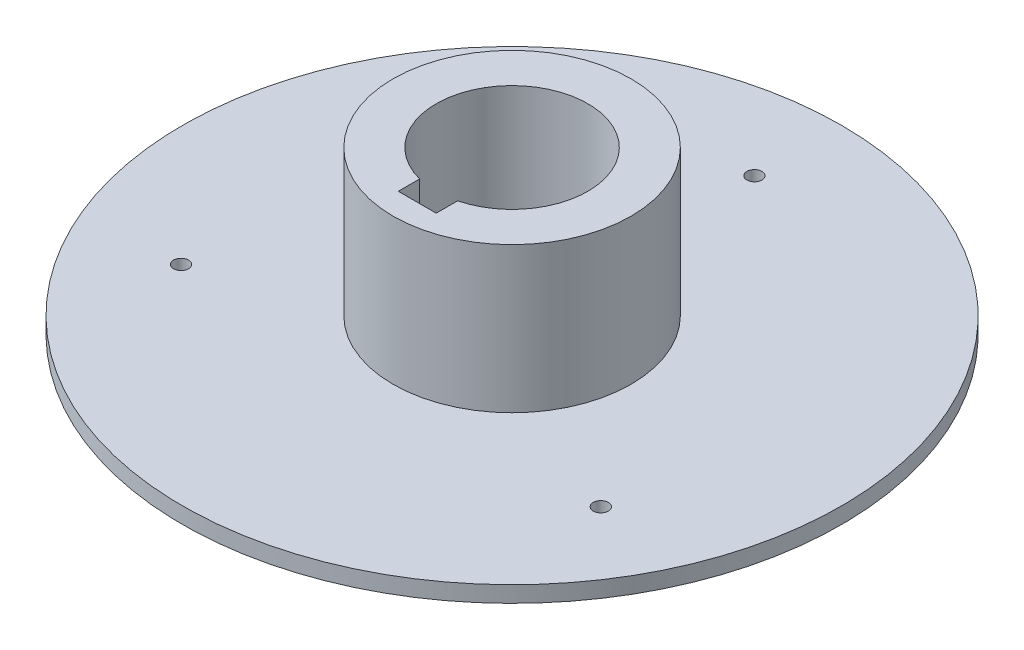
ISO-10303-21;
HEADER;
FILE_DESCRIPTION(('STEP AP214'),'2;1');
FILE_NAME('part.step','',(''),(''),'','','');
FILE_SCHEMA(('AUTOMOTIVE_DESIGN { 1 0 10303 214 1 1 1 1 }'));
ENDSEC;
DATA;
#1=APPLICATION_CONTEXT('core data for automotive mechanical design processes');
#2=APPLICATION_PROTOCOL_DEFINITION('international standard','automotive_design',2000,#1);
#3=PRODUCT_CONTEXT('',#1,'mechanical');
#4=PRODUCT('Part','Part','',(#3));
#5=PRODUCT_RELATED_PRODUCT_CATEGORY('part','',(#4));
#6=PRODUCT_DEFINITION_FORMATION('','',#4);
#7=PRODUCT_DEFINITION_CONTEXT('part definition',#1,'design');
#8=PRODUCT_DEFINITION('design','',#6,#7);
#9=PRODUCT_DEFINITION_SHAPE('','',#8);
#10=(LENGTH_UNIT() NAMED_UNIT(*) SI_UNIT(.MILLI.,.METRE.));
#11=(NAMED_UNIT(*) PLANE_ANGLE_UNIT() SI_UNIT($,.RADIAN.));
#12=(NAMED_UNIT(*) SI_UNIT($,.STERADIAN.) SOLID_ANGLE_UNIT());
#13=UNCERTAINTY_MEASURE_WITH_UNIT(LENGTH_MEASURE(1.E-05),#10,'distance_accuracy_value','');
#14=(GEOMETRIC_REPRESENTATION_CONTEXT(3) GLOBAL_UNCERTAINTY_ASSIGNED_CONTEXT((#13)) GLOBAL_UNIT_ASSIGNED_CONTEXT((#10,
#11,#12)) REPRESENTATION_CONTEXT('',''));
#15=CARTESIAN_POINT('',(0.,0.,0.));
#16=DIRECTION('',(0.,0.,1.));
#17=DIRECTION('',(1.,0.,0.));
#18=AXIS2_PLACEMENT_3D('',#15,#16,#17);
#19=CARTESIAN_POINT('',(0.,0.,0.));
#20=DIRECTION('',(0.,-1.,0.));
#21=DIRECTION('',(0.,0.,-1.));
#22=AXIS2_PLACEMENT_3D('',#19,#20,#21);
#23=CYLINDRICAL_SURFACE('',#22,69.5121297332499);
#24=CARTESIAN_POINT('',(0.,3.41233608835754,0.));
#25=DIRECTION('',(0.,-1.,0.));
#26=DIRECTION('',(0.,0.,-1.));
#27=AXIS2_PLACEMENT_3D('',#24,#25,#26);
#28=CIRCLE('',#27,69.5121297332499);
#29=CARTESIAN_POINT('',(0.,3.41233608835754,-69.5121297332499));
#30=VERTEX_POINT('',#29);
#31=EDGE_CURVE('E46',#30,#30,#28,.T.);
#32=ORIENTED_EDGE('',*,*,#31,.T.);
#33=EDGE_LOOP('',(#32));
#34=FACE_BOUND('',#33,.T.);
#35=CARTESIAN_POINT('',(0.,0.,0.));
#36=DIRECTION('',(0.,-1.,0.));
#37=DIRECTION('',(0.,0.,-1.));
#38=AXIS2_PLACEMENT_3D('',#35,#36,#37);
#39=CIRCLE('',#38,69.5121297332499);
#40=CARTESIAN_POINT('',(0.,0.,-69.5121297332499));
#41=VERTEX_POINT('',#40);
#42=EDGE_CURVE('E99',#41,#41,#39,.T.);
#43=ORIENTED_EDGE('',*,*,#42,.F.);
#44=EDGE_LOOP('',(#43));
#45=FACE_BOUND('',#44,.T.);
#46=ADVANCED_FACE('F39',(#34,#45),#23,.T.);
#47=CARTESIAN_POINT('',(0.,3.41233608835754,0.));
#48=DIRECTION('',(0.,1.,0.));
#49=DIRECTION('',(0.,0.,1.));
#50=AXIS2_PLACEMENT_3D('',#47,#48,#49);
#51=PLANE('',#50);
#52=CARTESIAN_POINT('',(-44.2647234509324,3.41233608835754,25.5562499999996));
#53=DIRECTION('',(0.,1.,0.));
#54=DIRECTION('',(0.,0.,1.));
#55=AXIS2_PLACEMENT_3D('',#52,#53,#54);
#56=CIRCLE('',#55,1.5875);
#57=CARTESIAN_POINT('',(-44.2647234509324,3.41233608835754,27.1437499999996));
#58=VERTEX_POINT('',#57);
#59=EDGE_CURVE('E236',#58,#58,#56,.T.);
#60=ORIENTED_EDGE('',*,*,#59,.F.);
#61=EDGE_LOOP('',(#60));
#62=FACE_BOUND('',#61,.T.);
#63=CARTESIAN_POINT('',(44.264723450932,3.41233608835754,25.5562500000002));
#64=DIRECTION('',(0.,1.,0.));
#65=DIRECTION('',(0.,0.,1.));
#66=AXIS2_PLACEMENT_3D('',#63,#64,#65);
#67=CIRCLE('',#66,1.5875);
#68=CARTESIAN_POINT('',(44.264723450932,3.41233608835754,27.1437500000002));
#69=VERTEX_POINT('',#68);
#70=EDGE_CURVE('E239',#69,#69,#67,.T.);
#71=ORIENTED_EDGE('',*,*,#70,.F.);
#72=EDGE_LOOP('',(#71));
#73=FACE_BOUND('',#72,.T.);
#74=CARTESIAN_POINT('',(0.,3.41233608835754,-51.1125));
#75=DIRECTION('',(0.,1.,0.));
#76=DIRECTION('',(0.,0.,1.));
#77=AXIS2_PLACEMENT_3D('',#74,#75,#76);
#78=CIRCLE('',#77,1.5875);
#79=CARTESIAN_POINT('',(0.,3.41233608835754,-49.525));
#80=VERTEX_POINT('',#79);
#81=EDGE_CURVE('E249',#80,#80,#78,.T.);
#82=ORIENTED_EDGE('',*,*,#81,.F.);
#83=EDGE_LOOP('',(#82));
#84=FACE_BOUND('',#83,.T.);
#85=CARTESIAN_POINT('',(0.,3.41233608835753,0.));
#86=DIRECTION('',(0.,-1.,0.));
#87=DIRECTION('',(0.,0.,-1.));
#88=AXIS2_PLACEMENT_3D('',#85,#86,#87);
#89=CIRCLE('',#88,25.0995629022868);
#90=CARTESIAN_POINT('',(0.,3.41233608835753,-25.0995629022868));
#91=VERTEX_POINT('',#90);
#92=EDGE_CURVE('E111',#91,#91,#89,.T.);
#93=ORIENTED_EDGE('',*,*,#92,.T.);
#94=EDGE_LOOP('',(#93));
#95=FACE_BOUND('',#94,.T.);
#96=ORIENTED_EDGE('',*,*,#31,.F.);
#97=EDGE_LOOP('',(#96));
#98=FACE_BOUND('',#97,.T.);
#99=ADVANCED_FACE('F118',(#62,#73,#84,#95,#98),#51,.T.);
#100=CARTESIAN_POINT('',(0.,0.,0.));
#101=DIRECTION('',(0.,-1.,0.));
#102=DIRECTION('',(0.,0.,-1.));
#103=AXIS2_PLACEMENT_3D('',#100,#101,#102);
#104=CYLINDRICAL_SURFACE('',#103,25.0995629022868);
#105=ORIENTED_EDGE('',*,*,#92,.F.);
#106=EDGE_LOOP('',(#105));
#107=FACE_BOUND('',#106,.T.);
#108=CARTESIAN_POINT('',(0.,34.1233608835753,0.));
#109=DIRECTION('',(0.,-1.,0.));
#110=DIRECTION('',(0.,0.,-1.));
#111=AXIS2_PLACEMENT_3D('',#108,#109,#110);
#112=CIRCLE('',#111,25.0995629022868);
#113=CARTESIAN_POINT('',(0.,34.1233608835753,-25.0995629022868));
#114=VERTEX_POINT('',#113);
#115=EDGE_CURVE('E102',#114,#114,#112,.T.);
#116=ORIENTED_EDGE('',*,*,#115,.T.);
#117=EDGE_LOOP('',(#116));
#118=FACE_BOUND('',#117,.T.);
#119=ADVANCED_FACE('F120',(#107,#118),#104,.T.);
#120=CARTESIAN_POINT('',(0.,34.1233608835753,0.));
#121=DIRECTION('',(0.,-1.,0.));
#122=DIRECTION('',(0.,0.,-1.));
#123=AXIS2_PLACEMENT_3D('',#120,#121,#122);
#124=PLANE('',#123);
#125=ORIENTED_EDGE('',*,*,#115,.F.);
#126=EDGE_LOOP('',(#125));
#127=FACE_BOUND('',#126,.T.);
#128=DIRECTION('',(1.,0.,0.));
#129=VECTOR('',#128,1.);
#130=CARTESIAN_POINT('',(0.,34.1233608835753,20.));
#131=LINE('',#130,#129);
#132=CARTESIAN_POINT('',(-4.,34.1233608835753,20.));
#133=VERTEX_POINT('',#132);
#134=CARTESIAN_POINT('',(4.00000000000002,34.1233608835753,20.));
#135=VERTEX_POINT('',#134);
#136=EDGE_CURVE('E264',#133,#135,#131,.T.);
#137=ORIENTED_EDGE('',*,*,#136,.F.);
#138=DIRECTION('',(0.,0.,1.));
#139=VECTOR('',#138,1.);
#140=CARTESIAN_POINT('',(-4.,34.1233608835753,20.));
#141=LINE('',#140,#139);
#142=CARTESIAN_POINT('',(-4.,34.1233608835753,15.4919333848297));
#143=VERTEX_POINT('',#142);
#144=EDGE_CURVE('E79',#143,#133,#141,.T.);
#145=ORIENTED_EDGE('',*,*,#144,.F.);
#146=CARTESIAN_POINT('',(0.,34.1233608835753,0.));
#147=DIRECTION('',(0.,-1.,0.));
#148=DIRECTION('',(0.,0.,-1.));
#149=AXIS2_PLACEMENT_3D('',#146,#147,#148);
#150=CIRCLE('',#149,16.);
#151=CARTESIAN_POINT('',(4.00000000000002,34.1233608835753,15.4919333848297));
#152=VERTEX_POINT('',#151);
#153=EDGE_CURVE('E98',#143,#152,#150,.T.);
#154=ORIENTED_EDGE('',*,*,#153,.T.);
#155=DIRECTION('',(0.,0.,-1.));
#156=VECTOR('',#155,1.);
#157=CARTESIAN_POINT('',(4.00000000000002,34.1233608835753,14.2342508421782));
#158=LINE('',#157,#156);
#159=EDGE_CURVE('E266',#135,#152,#158,.T.);
#160=ORIENTED_EDGE('',*,*,#159,.F.);
#161=EDGE_LOOP('',(#137,#145,#154,#160));
#162=FACE_BOUND('',#161,.T.);
#163=ADVANCED_FACE('F126',(#127,#162),#124,.F.);
#164=CARTESIAN_POINT('',(0.,0.,0.));
#165=DIRECTION('',(0.,-1.,0.));
#166=DIRECTION('',(0.,0.,-1.));
#167=AXIS2_PLACEMENT_3D('',#164,#165,#166);
#168=CYLINDRICAL_SURFACE('',#167,16.);
#169=ORIENTED_EDGE('',*,*,#153,.F.);
#170=DIRECTION('',(0.,-1.,0.));
#171=VECTOR('',#170,1.);
#172=CARTESIAN_POINT('',(-4.,0.,15.4919333848297));
#173=LINE('',#172,#171);
#174=CARTESIAN_POINT('',(-4.,0.,15.4919333848297));
#175=VERTEX_POINT('',#174);
#176=EDGE_CURVE('E237',#143,#175,#173,.T.);
#177=ORIENTED_EDGE('',*,*,#176,.T.);
#178=CARTESIAN_POINT('',(0.,0.,0.));
#179=DIRECTION('',(0.,-1.,0.));
#180=DIRECTION('',(0.,0.,-1.));
#181=AXIS2_PLACEMENT_3D('',#178,#179,#180);
#182=CIRCLE('',#181,16.);
#183=CARTESIAN_POINT('',(4.00000000000002,0.,15.4919333848297));
#184=VERTEX_POINT('',#183);
#185=EDGE_CURVE('E95',#175,#184,#182,.T.);
#186=ORIENTED_EDGE('',*,*,#185,.T.);
#187=DIRECTION('',(0.,-1.,0.));
#188=VECTOR('',#187,1.);
#189=CARTESIAN_POINT('',(4.00000000000002,0.,15.4919333848297));
#190=LINE('',#189,#188);
#191=EDGE_CURVE('E83',#184,#152,#190,.F.);
#192=ORIENTED_EDGE('',*,*,#191,.T.);
#193=EDGE_LOOP('',(#169,#177,#186,#192));
#194=FACE_BOUND('',#193,.T.);
#195=ADVANCED_FACE('F134',(#194),#168,.F.);
#196=CARTESIAN_POINT('',(0.,0.,0.));
#197=DIRECTION('',(0.,1.,0.));
#198=DIRECTION('',(0.,0.,1.));
#199=AXIS2_PLACEMENT_3D('',#196,#197,#198);
#200=PLANE('',#199);
#201=ORIENTED_EDGE('',*,*,#185,.F.);
#202=DIRECTION('',(0.,0.,1.));
#203=VECTOR('',#202,1.);
#204=CARTESIAN_POINT('',(-4.,0.,0.));
#205=LINE('',#204,#203);
#206=CARTESIAN_POINT('',(-4.,0.,20.));
#207=VERTEX_POINT('',#206);
#208=EDGE_CURVE('E11',#175,#207,#205,.T.);
#209=ORIENTED_EDGE('',*,*,#208,.T.);
#210=DIRECTION('',(1.,0.,0.));
#211=VECTOR('',#210,1.);
#212=CARTESIAN_POINT('',(0.,0.,20.));
#213=LINE('',#212,#211);
#214=CARTESIAN_POINT('',(4.00000000000002,0.,20.));
#215=VERTEX_POINT('',#214);
#216=EDGE_CURVE('E87',#207,#215,#213,.T.);
#217=ORIENTED_EDGE('',*,*,#216,.T.);
#218=DIRECTION('',(0.,0.,-1.));
#219=VECTOR('',#218,1.);
#220=CARTESIAN_POINT('',(4.00000000000002,0.,14.2342508421782));
#221=LINE('',#220,#219);
#222=EDGE_CURVE('E53',#215,#184,#221,.T.);
#223=ORIENTED_EDGE('',*,*,#222,.T.);
#224=EDGE_LOOP('',(#201,#209,#217,#223));
#225=FACE_BOUND('',#224,.T.);
#226=CARTESIAN_POINT('',(-44.2647234509324,0.,25.5562499999996));
#227=DIRECTION('',(0.,1.,0.));
#228=DIRECTION('',(0.,0.,1.));
#229=AXIS2_PLACEMENT_3D('',#226,#227,#228);
#230=CIRCLE('',#229,1.5875);
#231=CARTESIAN_POINT('',(-44.2647234509324,0.,27.1437499999996));
#232=VERTEX_POINT('',#231);
#233=EDGE_CURVE('E234',#232,#232,#230,.T.);
#234=ORIENTED_EDGE('',*,*,#233,.T.);
#235=EDGE_LOOP('',(#234));
#236=FACE_BOUND('',#235,.T.);
#237=CARTESIAN_POINT('',(44.264723450932,0.,25.5562500000002));
#238=DIRECTION('',(0.,1.,0.));
#239=DIRECTION('',(0.,0.,1.));
#240=AXIS2_PLACEMENT_3D('',#237,#238,#239);
#241=CIRCLE('',#240,1.5875);
#242=CARTESIAN_POINT('',(44.264723450932,0.,27.1437500000002));
#243=VERTEX_POINT('',#242);
#244=EDGE_CURVE('E246',#243,#243,#241,.T.);
#245=ORIENTED_EDGE('',*,*,#244,.T.);
#246=EDGE_LOOP('',(#245));
#247=FACE_BOUND('',#246,.T.);
#248=CARTESIAN_POINT('',(0.,0.,-51.1125));
#249=DIRECTION('',(0.,1.,0.));
#250=DIRECTION('',(0.,0.,1.));
#251=AXIS2_PLACEMENT_3D('',#248,#249,#250);
#252=CIRCLE('',#251,1.5875);
#253=CARTESIAN_POINT('',(0.,0.,-49.525));
#254=VERTEX_POINT('',#253);
#255=EDGE_CURVE('E105',#254,#254,#252,.T.);
#256=ORIENTED_EDGE('',*,*,#255,.T.);
#257=EDGE_LOOP('',(#256));
#258=FACE_BOUND('',#257,.T.);
#259=ORIENTED_EDGE('',*,*,#42,.T.);
#260=EDGE_LOOP('',(#259));
#261=FACE_BOUND('',#260,.T.);
#262=ADVANCED_FACE('F92',(#225,#236,#247,#258,#261),#200,.F.);
#263=CARTESIAN_POINT('',(0.,3.41233608835754,-51.1125));
#264=DIRECTION('',(0.,1.,0.));
#265=DIRECTION('',(0.,0.,1.));
#266=AXIS2_PLACEMENT_3D('',#263,#264,#265);
#267=CYLINDRICAL_SURFACE('',#266,1.5875);
#268=ORIENTED_EDGE('',*,*,#255,.F.);
#269=EDGE_LOOP('',(#268));
#270=FACE_BOUND('',#269,.T.);
#271=ORIENTED_EDGE('',*,*,#81,.T.);
#272=EDGE_LOOP('',(#271));
#273=FACE_BOUND('',#272,.T.);
#274=ADVANCED_FACE('F140',(#270,#273),#267,.F.);
#275=CARTESIAN_POINT('',(44.264723450932,3.41233608835754,25.5562500000002));
#276=DIRECTION('',(0.,1.,0.));
#277=DIRECTION('',(0.,0.,1.));
#278=AXIS2_PLACEMENT_3D('',#275,#276,#277);
#279=CYLINDRICAL_SURFACE('',#278,1.5875);
#280=ORIENTED_EDGE('',*,*,#244,.F.);
#281=EDGE_LOOP('',(#280));
#282=FACE_BOUND('',#281,.T.);
#283=ORIENTED_EDGE('',*,*,#70,.T.);
#284=EDGE_LOOP('',(#283));
#285=FACE_BOUND('',#284,.T.);
#286=ADVANCED_FACE('F143',(#282,#285),#279,.F.);
#287=CARTESIAN_POINT('',(-44.2647234509324,3.41233608835754,25.5562499999996));
#288=DIRECTION('',(0.,1.,0.));
#289=DIRECTION('',(0.,0.,1.));
#290=AXIS2_PLACEMENT_3D('',#287,#288,#289);
#291=CYLINDRICAL_SURFACE('',#290,1.5875);
#292=ORIENTED_EDGE('',*,*,#233,.F.);
#293=EDGE_LOOP('',(#292));
#294=FACE_BOUND('',#293,.T.);
#295=ORIENTED_EDGE('',*,*,#59,.T.);
#296=EDGE_LOOP('',(#295));
#297=FACE_BOUND('',#296,.T.);
#298=ADVANCED_FACE('F147',(#294,#297),#291,.F.);
#299=CARTESIAN_POINT('',(-4.,0.,20.));
#300=DIRECTION('',(-1.,0.,0.));
#301=DIRECTION('',(0.,0.,1.));
#302=AXIS2_PLACEMENT_3D('',#299,#300,#301);
#303=PLANE('',#302);
#304=ORIENTED_EDGE('',*,*,#144,.T.);
#305=DIRECTION('',(0.,1.,0.));
#306=VECTOR('',#305,1.);
#307=CARTESIAN_POINT('',(-4.,0.,20.));
#308=LINE('',#307,#306);
#309=EDGE_CURVE('E75',#207,#133,#308,.T.);
#310=ORIENTED_EDGE('',*,*,#309,.F.);
#311=ORIENTED_EDGE('',*,*,#208,.F.);
#312=ORIENTED_EDGE('',*,*,#176,.F.);
#313=EDGE_LOOP('',(#304,#310,#311,#312));
#314=FACE_BOUND('',#313,.T.);
#315=ADVANCED_FACE('F77',(#314),#303,.F.);
#316=CARTESIAN_POINT('',(4.00000000000002,0.,14.2342508421782));
#317=DIRECTION('',(1.,0.,0.));
#318=DIRECTION('',(0.,0.,-1.));
#319=AXIS2_PLACEMENT_3D('',#316,#317,#318);
#320=PLANE('',#319);
#321=ORIENTED_EDGE('',*,*,#222,.F.);
#322=DIRECTION('',(0.,1.,0.));
#323=VECTOR('',#322,1.);
#324=CARTESIAN_POINT('',(4.00000000000002,0.,20.));
#325=LINE('',#324,#323);
#326=EDGE_CURVE('E84',#215,#135,#325,.T.);
#327=ORIENTED_EDGE('',*,*,#326,.T.);
#328=ORIENTED_EDGE('',*,*,#159,.T.);
#329=ORIENTED_EDGE('',*,*,#191,.F.);
#330=EDGE_LOOP('',(#321,#327,#328,#329));
#331=FACE_BOUND('',#330,.T.);
#332=ADVANCED_FACE('F154',(#331),#320,.F.);
#333=CARTESIAN_POINT('',(0.,0.,20.));
#334=DIRECTION('',(0.,0.,1.));
#335=DIRECTION('',(1.,0.,0.));
#336=AXIS2_PLACEMENT_3D('',#333,#334,#335);
#337=PLANE('',#336);
#338=ORIENTED_EDGE('',*,*,#136,.T.);
#339=ORIENTED_EDGE('',*,*,#326,.F.);
#340=ORIENTED_EDGE('',*,*,#216,.F.);
#341=ORIENTED_EDGE('',*,*,#309,.T.);
#342=EDGE_LOOP('',(#338,#339,#340,#341));
#343=FACE_BOUND('',#342,.T.);
#344=ADVANCED_FACE('F88',(#343),#337,.F.);
#345=CLOSED_SHELL('',(#46,#99,#119,#163,#195,#262,#274,#286,#298,#315,#332,#344));
#346=MANIFOLD_SOLID_BREP('B2',#345);
#347=ADVANCED_BREP_SHAPE_REPRESENTATION('',(#18,#346),#14);
#348=SHAPE_DEFINITION_REPRESENTATION(#9,#347);
ENDSEC;
END-ISO-10303-21;
